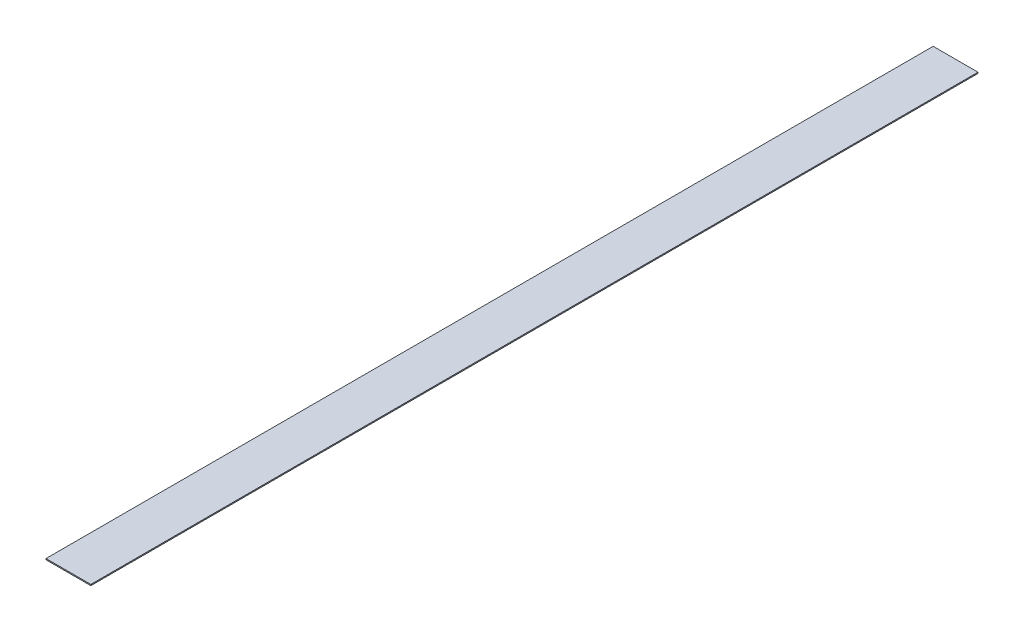
ISO-10303-21;
HEADER;
FILE_DESCRIPTION(('STEP AP214'),'2;1');
FILE_NAME('part.step','',(''),(''),'','','');
FILE_SCHEMA(('AUTOMOTIVE_DESIGN { 1 0 10303 214 1 1 1 1 }'));
ENDSEC;
DATA;
#1=APPLICATION_CONTEXT('core data for automotive mechanical design processes');
#2=APPLICATION_PROTOCOL_DEFINITION('international standard','automotive_design',2000,#1);
#3=PRODUCT_CONTEXT('',#1,'mechanical');
#4=PRODUCT('Part','Part','',(#3));
#5=PRODUCT_RELATED_PRODUCT_CATEGORY('part','',(#4));
#6=PRODUCT_DEFINITION_FORMATION('','',#4);
#7=PRODUCT_DEFINITION_CONTEXT('part definition',#1,'design');
#8=PRODUCT_DEFINITION('design','',#6,#7);
#9=PRODUCT_DEFINITION_SHAPE('','',#8);
#10=(LENGTH_UNIT() NAMED_UNIT(*) SI_UNIT(.MILLI.,.METRE.));
#11=(NAMED_UNIT(*) PLANE_ANGLE_UNIT() SI_UNIT($,.RADIAN.));
#12=(NAMED_UNIT(*) SI_UNIT($,.STERADIAN.) SOLID_ANGLE_UNIT());
#13=UNCERTAINTY_MEASURE_WITH_UNIT(LENGTH_MEASURE(1.E-05),#10,'distance_accuracy_value','');
#14=(GEOMETRIC_REPRESENTATION_CONTEXT(3) GLOBAL_UNCERTAINTY_ASSIGNED_CONTEXT((#13)) GLOBAL_UNIT_ASSIGNED_CONTEXT((#10,
#11,#12)) REPRESENTATION_CONTEXT('',''));
#15=CARTESIAN_POINT('',(0.,0.,0.));
#16=DIRECTION('',(0.,0.,1.));
#17=DIRECTION('',(1.,0.,0.));
#18=AXIS2_PLACEMENT_3D('',#15,#16,#17);
#19=CARTESIAN_POINT('',(0.,0.,0.));
#20=DIRECTION('',(0.,1.,0.));
#21=DIRECTION('',(0.,0.,1.));
#22=AXIS2_PLACEMENT_3D('',#19,#20,#21);
#23=PLANE('',#22);
#24=DIRECTION('',(1.,0.,0.));
#25=VECTOR('',#24,1.);
#26=CARTESIAN_POINT('',(8.78852546293275E-12,0.,502.666000000001));
#27=LINE('',#26,#25);
#28=CARTESIAN_POINT('',(-25.4,0.,502.666000000001));
#29=VERTEX_POINT('',#28);
#30=CARTESIAN_POINT('',(25.4,0.,502.666));
#31=VERTEX_POINT('',#30);
#32=EDGE_CURVE('E106',#29,#31,#27,.T.);
#33=ORIENTED_EDGE('',*,*,#32,.F.);
#34=DIRECTION('',(0.,0.,-1.));
#35=VECTOR('',#34,1.);
#36=CARTESIAN_POINT('',(-25.4,0.,0.));
#37=LINE('',#36,#35);
#38=CARTESIAN_POINT('',(-25.4,0.,-502.666));
#39=VERTEX_POINT('',#38);
#40=EDGE_CURVE('E101',#29,#39,#37,.T.);
#41=ORIENTED_EDGE('',*,*,#40,.T.);
#42=DIRECTION('',(1.,0.,0.));
#43=VECTOR('',#42,1.);
#44=CARTESIAN_POINT('',(-25.4,0.,-502.666));
#45=LINE('',#44,#43);
#46=CARTESIAN_POINT('',(25.4,0.,-502.666));
#47=VERTEX_POINT('',#46);
#48=EDGE_CURVE('E104',#39,#47,#45,.T.);
#49=ORIENTED_EDGE('',*,*,#48,.T.);
#50=DIRECTION('',(0.,0.,-1.));
#51=VECTOR('',#50,1.);
#52=CARTESIAN_POINT('',(25.4,0.,0.));
#53=LINE('',#52,#51);
#54=EDGE_CURVE('E95',#31,#47,#53,.T.);
#55=ORIENTED_EDGE('',*,*,#54,.F.);
#56=EDGE_LOOP('',(#33,#41,#49,#55));
#57=FACE_BOUND('',#56,.T.);
#58=ADVANCED_FACE('F59',(#57),#23,.F.);
#59=CARTESIAN_POINT('',(25.4,1.27,0.));
#60=DIRECTION('',(-1.,0.,0.));
#61=DIRECTION('',(0.,0.,1.));
#62=AXIS2_PLACEMENT_3D('',#59,#60,#61);
#63=PLANE('',#62);
#64=ORIENTED_EDGE('',*,*,#54,.T.);
#65=DIRECTION('',(0.,-1.,0.));
#66=VECTOR('',#65,1.);
#67=CARTESIAN_POINT('',(25.4,1.27,-502.666));
#68=LINE('',#67,#66);
#69=CARTESIAN_POINT('',(25.4,1.27,-502.666));
#70=VERTEX_POINT('',#69);
#71=EDGE_CURVE('E63',#70,#47,#68,.T.);
#72=ORIENTED_EDGE('',*,*,#71,.F.);
#73=DIRECTION('',(0.,0.,-1.));
#74=VECTOR('',#73,1.);
#75=CARTESIAN_POINT('',(25.4,1.27,0.));
#76=LINE('',#75,#74);
#77=CARTESIAN_POINT('',(25.4,1.27,502.666));
#78=VERTEX_POINT('',#77);
#79=EDGE_CURVE('E125',#78,#70,#76,.T.);
#80=ORIENTED_EDGE('',*,*,#79,.F.);
#81=DIRECTION('',(0.,-1.,0.));
#82=VECTOR('',#81,1.);
#83=CARTESIAN_POINT('',(25.4,1.27,502.666));
#84=LINE('',#83,#82);
#85=EDGE_CURVE('E12',#78,#31,#84,.T.);
#86=ORIENTED_EDGE('',*,*,#85,.T.);
#87=EDGE_LOOP('',(#64,#72,#80,#86));
#88=FACE_BOUND('',#87,.T.);
#89=ADVANCED_FACE('F133',(#88),#63,.F.);
#90=CARTESIAN_POINT('',(8.78852546293275E-12,1.27,502.666000000001));
#91=DIRECTION('',(0.,0.,-1.));
#92=DIRECTION('',(-1.,0.,0.));
#93=AXIS2_PLACEMENT_3D('',#90,#91,#92);
#94=PLANE('',#93);
#95=ORIENTED_EDGE('',*,*,#32,.T.);
#96=ORIENTED_EDGE('',*,*,#85,.F.);
#97=DIRECTION('',(1.,0.,0.));
#98=VECTOR('',#97,1.);
#99=CARTESIAN_POINT('',(8.78852546293275E-12,1.27,502.666000000001));
#100=LINE('',#99,#98);
#101=CARTESIAN_POINT('',(-25.4,1.27,502.666000000001));
#102=VERTEX_POINT('',#101);
#103=EDGE_CURVE('E107',#102,#78,#100,.T.);
#104=ORIENTED_EDGE('',*,*,#103,.F.);
#105=DIRECTION('',(0.,-1.,0.));
#106=VECTOR('',#105,1.);
#107=CARTESIAN_POINT('',(-25.4,1.27,502.666000000001));
#108=LINE('',#107,#106);
#109=EDGE_CURVE('E69',#102,#29,#108,.T.);
#110=ORIENTED_EDGE('',*,*,#109,.T.);
#111=EDGE_LOOP('',(#95,#96,#104,#110));
#112=FACE_BOUND('',#111,.T.);
#113=ADVANCED_FACE('F132',(#112),#94,.F.);
#114=CARTESIAN_POINT('',(-25.4,1.27,0.));
#115=DIRECTION('',(-1.,0.,0.));
#116=DIRECTION('',(0.,0.,1.));
#117=AXIS2_PLACEMENT_3D('',#114,#115,#116);
#118=PLANE('',#117);
#119=ORIENTED_EDGE('',*,*,#40,.F.);
#120=ORIENTED_EDGE('',*,*,#109,.F.);
#121=DIRECTION('',(0.,0.,-1.));
#122=VECTOR('',#121,1.);
#123=CARTESIAN_POINT('',(-25.4,1.27,0.));
#124=LINE('',#123,#122);
#125=CARTESIAN_POINT('',(-25.4,1.27,-502.666));
#126=VERTEX_POINT('',#125);
#127=EDGE_CURVE('E113',#102,#126,#124,.T.);
#128=ORIENTED_EDGE('',*,*,#127,.T.);
#129=DIRECTION('',(0.,-1.,0.));
#130=VECTOR('',#129,1.);
#131=CARTESIAN_POINT('',(-25.4,1.27,-502.666));
#132=LINE('',#131,#130);
#133=EDGE_CURVE('E110',#126,#39,#132,.T.);
#134=ORIENTED_EDGE('',*,*,#133,.T.);
#135=EDGE_LOOP('',(#119,#120,#128,#134));
#136=FACE_BOUND('',#135,.T.);
#137=ADVANCED_FACE('F111',(#136),#118,.T.);
#138=CARTESIAN_POINT('',(0.,1.27,0.));
#139=DIRECTION('',(0.,1.,0.));
#140=DIRECTION('',(0.,0.,1.));
#141=AXIS2_PLACEMENT_3D('',#138,#139,#140);
#142=PLANE('',#141);
#143=ORIENTED_EDGE('',*,*,#103,.T.);
#144=ORIENTED_EDGE('',*,*,#79,.T.);
#145=DIRECTION('',(1.,0.,0.));
#146=VECTOR('',#145,1.);
#147=CARTESIAN_POINT('',(-25.4,1.27,-502.666));
#148=LINE('',#147,#146);
#149=EDGE_CURVE('E117',#126,#70,#148,.T.);
#150=ORIENTED_EDGE('',*,*,#149,.F.);
#151=ORIENTED_EDGE('',*,*,#127,.F.);
#152=EDGE_LOOP('',(#143,#144,#150,#151));
#153=FACE_BOUND('',#152,.T.);
#154=ADVANCED_FACE('F130',(#153),#142,.T.);
#155=CARTESIAN_POINT('',(-25.4,1.27,-502.666));
#156=DIRECTION('',(0.,0.,-1.));
#157=DIRECTION('',(-1.,0.,0.));
#158=AXIS2_PLACEMENT_3D('',#155,#156,#157);
#159=PLANE('',#158);
#160=ORIENTED_EDGE('',*,*,#48,.F.);
#161=ORIENTED_EDGE('',*,*,#133,.F.);
#162=ORIENTED_EDGE('',*,*,#149,.T.);
#163=ORIENTED_EDGE('',*,*,#71,.T.);
#164=EDGE_LOOP('',(#160,#161,#162,#163));
#165=FACE_BOUND('',#164,.T.);
#166=ADVANCED_FACE('F61',(#165),#159,.T.);
#167=CLOSED_SHELL('',(#58,#89,#113,#137,#154,#166));
#168=MANIFOLD_SOLID_BREP('B2',#167);
#169=ADVANCED_BREP_SHAPE_REPRESENTATION('',(#18,#168),#14);
#170=SHAPE_DEFINITION_REPRESENTATION(#9,#169);
ENDSEC;
END-ISO-10303-21;
